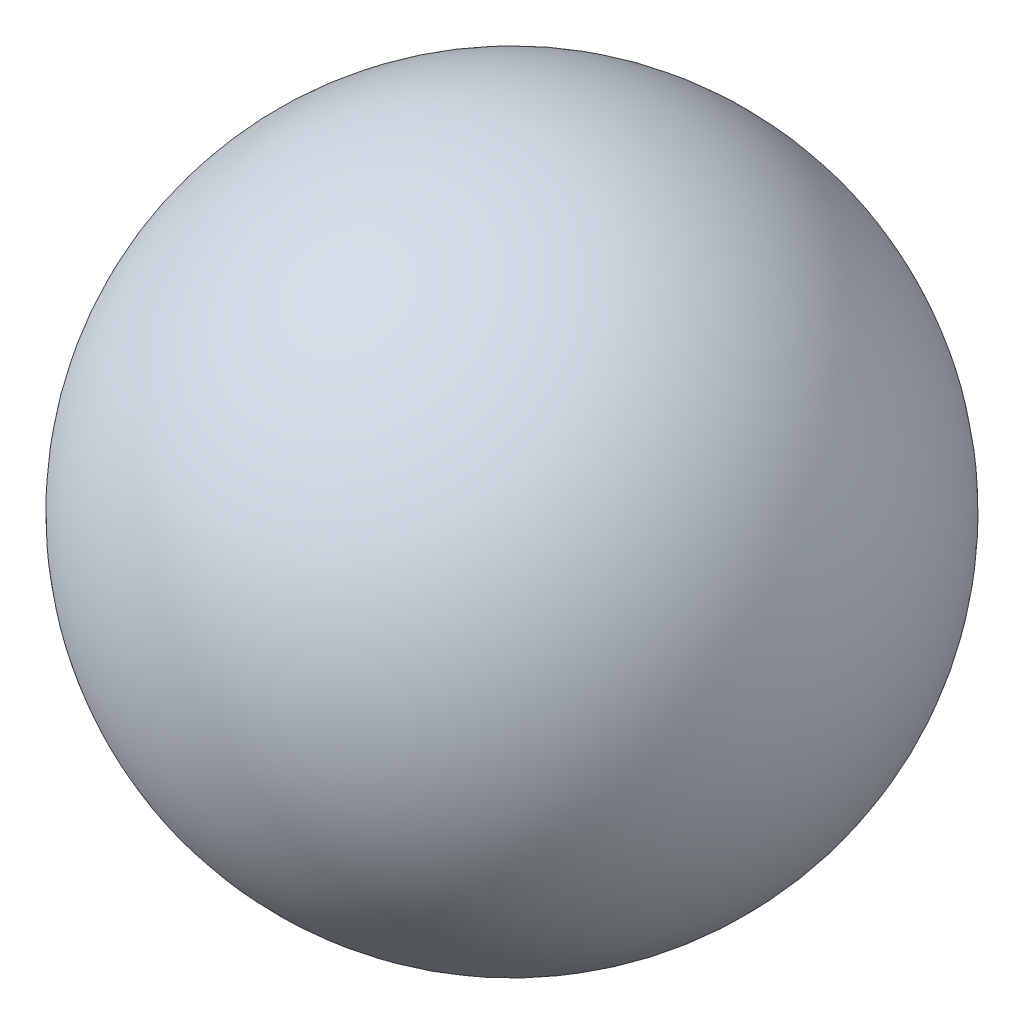
ISO-10303-21;
HEADER;
FILE_DESCRIPTION(('STEP AP214'),'2;1');
FILE_NAME('part.step','',(''),(''),'','','');
FILE_SCHEMA(('AUTOMOTIVE_DESIGN { 1 0 10303 214 1 1 1 1 }'));
ENDSEC;
DATA;
#1=APPLICATION_CONTEXT('core data for automotive mechanical design processes');
#2=APPLICATION_PROTOCOL_DEFINITION('international standard','automotive_design',2000,#1);
#3=PRODUCT_CONTEXT('',#1,'mechanical');
#4=PRODUCT('Part','Part','',(#3));
#5=PRODUCT_RELATED_PRODUCT_CATEGORY('part','',(#4));
#6=PRODUCT_DEFINITION_FORMATION('','',#4);
#7=PRODUCT_DEFINITION_CONTEXT('part definition',#1,'design');
#8=PRODUCT_DEFINITION('design','',#6,#7);
#9=PRODUCT_DEFINITION_SHAPE('','',#8);
#10=(LENGTH_UNIT() NAMED_UNIT(*) SI_UNIT(.MILLI.,.METRE.));
#11=(NAMED_UNIT(*) PLANE_ANGLE_UNIT() SI_UNIT($,.RADIAN.));
#12=(NAMED_UNIT(*) SI_UNIT($,.STERADIAN.) SOLID_ANGLE_UNIT());
#13=UNCERTAINTY_MEASURE_WITH_UNIT(LENGTH_MEASURE(1.E-05),#10,'distance_accuracy_value','');
#14=(GEOMETRIC_REPRESENTATION_CONTEXT(3) GLOBAL_UNCERTAINTY_ASSIGNED_CONTEXT((#13)) GLOBAL_UNIT_ASSIGNED_CONTEXT((#10,
#11,#12)) REPRESENTATION_CONTEXT('',''));
#15=CARTESIAN_POINT('',(0.,0.,0.));
#16=DIRECTION('',(0.,0.,1.));
#17=DIRECTION('',(1.,0.,0.));
#18=AXIS2_PLACEMENT_3D('',#15,#16,#17);
#19=CARTESIAN_POINT('',(0.,0.,0.));
#20=DIRECTION('',(0.,0.,-1.));
#21=DIRECTION('',(1.,0.,0.));
#22=AXIS2_PLACEMENT_3D('',#19,#20,#21);
#23=SPHERICAL_SURFACE('',#22,8.);
#24=CARTESIAN_POINT('',(0.,0.,-8.));
#25=VERTEX_POINT('',#24);
#26=VERTEX_LOOP('',#25);
#27=FACE_BOUND('',#26,.T.);
#28=ADVANCED_FACE('F27',(#27),#23,.T.);
#29=CLOSED_SHELL('',(#28));
#30=MANIFOLD_SOLID_BREP('B2',#29);
#31=ADVANCED_BREP_SHAPE_REPRESENTATION('',(#18,#30),#14);
#32=SHAPE_DEFINITION_REPRESENTATION(#9,#31);
ENDSEC;
END-ISO-10303-21;
